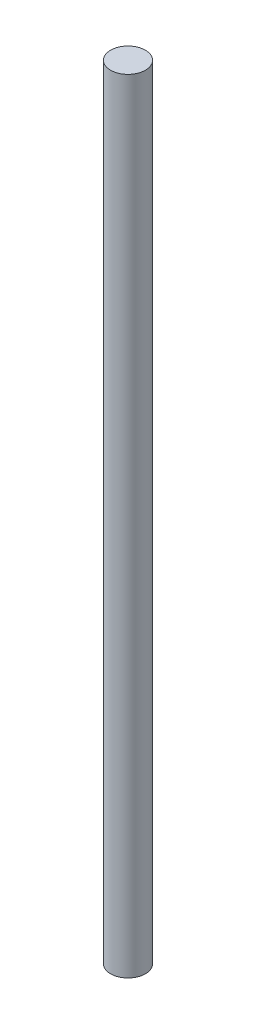
ISO-10303-21;
HEADER;
FILE_DESCRIPTION(('STEP AP214'),'2;1');
FILE_NAME('part.step','',(''),(''),'','','');
FILE_SCHEMA(('AUTOMOTIVE_DESIGN { 1 0 10303 214 1 1 1 1 }'));
ENDSEC;
DATA;
#1=APPLICATION_CONTEXT('core data for automotive mechanical design processes');
#2=APPLICATION_PROTOCOL_DEFINITION('international standard','automotive_design',2000,#1);
#3=PRODUCT_CONTEXT('',#1,'mechanical');
#4=PRODUCT('Part','Part','',(#3));
#5=PRODUCT_RELATED_PRODUCT_CATEGORY('part','',(#4));
#6=PRODUCT_DEFINITION_FORMATION('','',#4);
#7=PRODUCT_DEFINITION_CONTEXT('part definition',#1,'design');
#8=PRODUCT_DEFINITION('design','',#6,#7);
#9=PRODUCT_DEFINITION_SHAPE('','',#8);
#10=(LENGTH_UNIT() NAMED_UNIT(*) SI_UNIT(.MILLI.,.METRE.));
#11=(NAMED_UNIT(*) PLANE_ANGLE_UNIT() SI_UNIT($,.RADIAN.));
#12=(NAMED_UNIT(*) SI_UNIT($,.STERADIAN.) SOLID_ANGLE_UNIT());
#13=UNCERTAINTY_MEASURE_WITH_UNIT(LENGTH_MEASURE(1.E-05),#10,'distance_accuracy_value','');
#14=(GEOMETRIC_REPRESENTATION_CONTEXT(3) GLOBAL_UNCERTAINTY_ASSIGNED_CONTEXT((#13)) GLOBAL_UNIT_ASSIGNED_CONTEXT((#10,
#11,#12)) REPRESENTATION_CONTEXT('',''));
#15=CARTESIAN_POINT('',(0.,0.,0.));
#16=DIRECTION('',(0.,0.,1.));
#17=DIRECTION('',(1.,0.,0.));
#18=AXIS2_PLACEMENT_3D('',#15,#16,#17);
#19=CARTESIAN_POINT('',(0.,91.44,0.));
#20=DIRECTION('',(0.,-1.,0.));
#21=DIRECTION('',(0.,0.,-1.));
#22=AXIS2_PLACEMENT_3D('',#19,#20,#21);
#23=CYLINDRICAL_SURFACE('',#22,2.032);
#24=CARTESIAN_POINT('',(0.,91.44,0.));
#25=DIRECTION('',(0.,1.,0.));
#26=DIRECTION('',(0.,0.,1.));
#27=AXIS2_PLACEMENT_3D('',#24,#25,#26);
#28=CIRCLE('',#27,2.032);
#29=CARTESIAN_POINT('',(0.,91.44,2.032));
#30=VERTEX_POINT('',#29);
#31=EDGE_CURVE('E10',#30,#30,#28,.T.);
#32=ORIENTED_EDGE('',*,*,#31,.F.);
#33=EDGE_LOOP('',(#32));
#34=FACE_BOUND('',#33,.T.);
#35=CARTESIAN_POINT('',(0.,0.,0.));
#36=DIRECTION('',(0.,1.,0.));
#37=DIRECTION('',(0.,0.,1.));
#38=AXIS2_PLACEMENT_3D('',#35,#36,#37);
#39=CIRCLE('',#38,2.032);
#40=CARTESIAN_POINT('',(0.,0.,2.032));
#41=VERTEX_POINT('',#40);
#42=EDGE_CURVE('E34',#41,#41,#39,.T.);
#43=ORIENTED_EDGE('',*,*,#42,.T.);
#44=EDGE_LOOP('',(#43));
#45=FACE_BOUND('',#44,.T.);
#46=ADVANCED_FACE('F31',(#34,#45),#23,.T.);
#47=CARTESIAN_POINT('',(0.,91.44,0.));
#48=DIRECTION('',(0.,1.,0.));
#49=DIRECTION('',(0.,0.,1.));
#50=AXIS2_PLACEMENT_3D('',#47,#48,#49);
#51=PLANE('',#50);
#52=ORIENTED_EDGE('',*,*,#31,.T.);
#53=EDGE_LOOP('',(#52));
#54=FACE_BOUND('',#53,.T.);
#55=ADVANCED_FACE('F46',(#54),#51,.T.);
#56=CARTESIAN_POINT('',(0.,0.,0.));
#57=DIRECTION('',(0.,1.,0.));
#58=DIRECTION('',(0.,0.,1.));
#59=AXIS2_PLACEMENT_3D('',#56,#57,#58);
#60=PLANE('',#59);
#61=ORIENTED_EDGE('',*,*,#42,.F.);
#62=EDGE_LOOP('',(#61));
#63=FACE_BOUND('',#62,.T.);
#64=ADVANCED_FACE('F44',(#63),#60,.F.);
#65=CLOSED_SHELL('',(#46,#55,#64));
#66=MANIFOLD_SOLID_BREP('B2',#65);
#67=ADVANCED_BREP_SHAPE_REPRESENTATION('',(#18,#66),#14);
#68=SHAPE_DEFINITION_REPRESENTATION(#9,#67);
ENDSEC;
END-ISO-10303-21;
